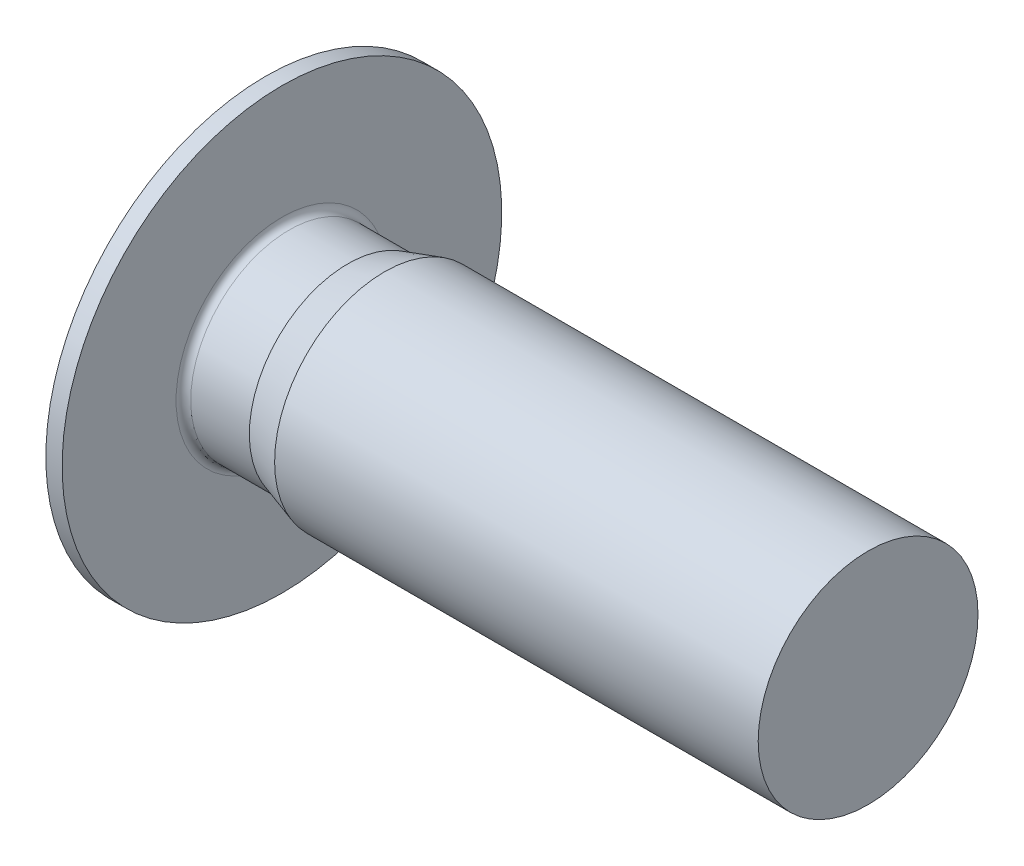
ISO-10303-21;
HEADER;
FILE_DESCRIPTION(('STEP AP214'),'2;1');
FILE_NAME('part.step','',(''),(''),'','','');
FILE_SCHEMA(('AUTOMOTIVE_DESIGN { 1 0 10303 214 1 1 1 1 }'));
ENDSEC;
DATA;
#1=APPLICATION_CONTEXT('core data for automotive mechanical design processes');
#2=APPLICATION_PROTOCOL_DEFINITION('international standard','automotive_design',2000,#1);
#3=PRODUCT_CONTEXT('',#1,'mechanical');
#4=PRODUCT('Part','Part','',(#3));
#5=PRODUCT_RELATED_PRODUCT_CATEGORY('part','',(#4));
#6=PRODUCT_DEFINITION_FORMATION('','',#4);
#7=PRODUCT_DEFINITION_CONTEXT('part definition',#1,'design');
#8=PRODUCT_DEFINITION('design','',#6,#7);
#9=PRODUCT_DEFINITION_SHAPE('','',#8);
#10=(LENGTH_UNIT() NAMED_UNIT(*) SI_UNIT(.MILLI.,.METRE.));
#11=(NAMED_UNIT(*) PLANE_ANGLE_UNIT() SI_UNIT($,.RADIAN.));
#12=(NAMED_UNIT(*) SI_UNIT($,.STERADIAN.) SOLID_ANGLE_UNIT());
#13=UNCERTAINTY_MEASURE_WITH_UNIT(LENGTH_MEASURE(1.E-05),#10,'distance_accuracy_value','');
#14=(GEOMETRIC_REPRESENTATION_CONTEXT(3) GLOBAL_UNCERTAINTY_ASSIGNED_CONTEXT((#13)) GLOBAL_UNIT_ASSIGNED_CONTEXT((#10,
#11,#12)) REPRESENTATION_CONTEXT('',''));
#15=CARTESIAN_POINT('',(0.,0.,0.));
#16=DIRECTION('',(0.,0.,1.));
#17=DIRECTION('',(1.,0.,0.));
#18=AXIS2_PLACEMENT_3D('',#15,#16,#17);
#19=CARTESIAN_POINT('',(1.2,0.,0.));
#20=DIRECTION('',(-1.,0.,0.));
#21=DIRECTION('',(0.,0.,1.));
#22=AXIS2_PLACEMENT_3D('',#19,#20,#21);
#23=PLANE('',#22);
#24=CARTESIAN_POINT('',(1.2,0.,0.));
#25=DIRECTION('',(-1.,0.,0.));
#26=DIRECTION('',(0.,-1.,0.));
#27=AXIS2_PLACEMENT_3D('',#24,#25,#26);
#28=CIRCLE('',#27,0.75);
#29=CARTESIAN_POINT('',(1.2,-0.649519052838329,0.375));
#30=VERTEX_POINT('',#29);
#31=CARTESIAN_POINT('',(1.2,0.,0.75));
#32=VERTEX_POINT('',#31);
#33=EDGE_CURVE('E48',#30,#32,#28,.T.);
#34=ORIENTED_EDGE('',*,*,#33,.F.);
#35=DIRECTION('',(0.,0.5,0.866025403784439));
#36=VECTOR('',#35,1.);
#37=CARTESIAN_POINT('',(1.2,-0.866025403784439,0.));
#38=LINE('',#37,#36);
#39=CARTESIAN_POINT('',(1.2,-0.43301270189222,0.75));
#40=VERTEX_POINT('',#39);
#41=EDGE_CURVE('E263',#30,#40,#38,.T.);
#42=ORIENTED_EDGE('',*,*,#41,.T.);
#43=DIRECTION('',(0.,1.,0.));
#44=VECTOR('',#43,1.);
#45=CARTESIAN_POINT('',(1.2,-0.43301270189222,0.75));
#46=LINE('',#45,#44);
#47=EDGE_CURVE('E231',#40,#32,#46,.T.);
#48=ORIENTED_EDGE('',*,*,#47,.T.);
#49=EDGE_LOOP('',(#34,#42,#48));
#50=FACE_BOUND('',#49,.T.);
#51=ADVANCED_FACE('F37',(#50),#23,.T.);
#52=CARTESIAN_POINT('',(1.2,0.649519052838329,0.375));
#53=VERTEX_POINT('',#52);
#54=EDGE_CURVE('E11',#32,#53,#28,.T.);
#55=ORIENTED_EDGE('',*,*,#54,.F.);
#56=CARTESIAN_POINT('',(1.2,0.43301270189222,0.75));
#57=VERTEX_POINT('',#56);
#58=EDGE_CURVE('E256',#32,#57,#46,.T.);
#59=ORIENTED_EDGE('',*,*,#58,.T.);
#60=DIRECTION('',(0.,0.5,-0.866025403784439));
#61=VECTOR('',#60,1.);
#62=CARTESIAN_POINT('',(1.2,0.43301270189222,0.75));
#63=LINE('',#62,#61);
#64=EDGE_CURVE('E277',#57,#53,#63,.T.);
#65=ORIENTED_EDGE('',*,*,#64,.T.);
#66=EDGE_LOOP('',(#55,#59,#65));
#67=FACE_BOUND('',#66,.T.);
#68=ADVANCED_FACE('F124',(#67),#23,.T.);
#69=CARTESIAN_POINT('',(1.2,0.649519052838329,-0.375));
#70=VERTEX_POINT('',#69);
#71=EDGE_CURVE('E46',#53,#70,#28,.T.);
#72=ORIENTED_EDGE('',*,*,#71,.F.);
#73=CARTESIAN_POINT('',(1.2,0.866025403784439,0.));
#74=VERTEX_POINT('',#73);
#75=EDGE_CURVE('E244',#53,#74,#63,.T.);
#76=ORIENTED_EDGE('',*,*,#75,.T.);
#77=DIRECTION('',(0.,-0.5,-0.866025403784439));
#78=VECTOR('',#77,1.);
#79=CARTESIAN_POINT('',(1.2,0.866025403784439,0.));
#80=LINE('',#79,#78);
#81=EDGE_CURVE('E274',#74,#70,#80,.T.);
#82=ORIENTED_EDGE('',*,*,#81,.T.);
#83=EDGE_LOOP('',(#72,#76,#82));
#84=FACE_BOUND('',#83,.T.);
#85=ADVANCED_FACE('F129',(#84),#23,.T.);
#86=CARTESIAN_POINT('',(1.2,0.,-0.75));
#87=VERTEX_POINT('',#86);
#88=EDGE_CURVE('E222',#70,#87,#28,.T.);
#89=ORIENTED_EDGE('',*,*,#88,.F.);
#90=CARTESIAN_POINT('',(1.2,0.433012701892219,-0.75));
#91=VERTEX_POINT('',#90);
#92=EDGE_CURVE('E276',#70,#91,#80,.T.);
#93=ORIENTED_EDGE('',*,*,#92,.T.);
#94=DIRECTION('',(0.,-1.,0.));
#95=VECTOR('',#94,1.);
#96=CARTESIAN_POINT('',(1.2,0.433012701892219,-0.75));
#97=LINE('',#96,#95);
#98=EDGE_CURVE('E270',#91,#87,#97,.T.);
#99=ORIENTED_EDGE('',*,*,#98,.T.);
#100=EDGE_LOOP('',(#89,#93,#99));
#101=FACE_BOUND('',#100,.T.);
#102=ADVANCED_FACE('F188',(#101),#23,.T.);
#103=CARTESIAN_POINT('',(1.2,-0.649519052838329,-0.375));
#104=VERTEX_POINT('',#103);
#105=EDGE_CURVE('E55',#87,#104,#28,.T.);
#106=ORIENTED_EDGE('',*,*,#105,.F.);
#107=CARTESIAN_POINT('',(1.2,-0.43301270189222,-0.75));
#108=VERTEX_POINT('',#107);
#109=EDGE_CURVE('E273',#87,#108,#97,.T.);
#110=ORIENTED_EDGE('',*,*,#109,.T.);
#111=DIRECTION('',(0.,-0.5,0.866025403784438));
#112=VECTOR('',#111,1.);
#113=CARTESIAN_POINT('',(1.2,-0.43301270189222,-0.75));
#114=LINE('',#113,#112);
#115=EDGE_CURVE('E265',#108,#104,#114,.T.);
#116=ORIENTED_EDGE('',*,*,#115,.T.);
#117=EDGE_LOOP('',(#106,#110,#116));
#118=FACE_BOUND('',#117,.T.);
#119=ADVANCED_FACE('F122',(#118),#23,.T.);
#120=CARTESIAN_POINT('',(-0.8,0.,0.));
#121=DIRECTION('',(-1.,0.,0.));
#122=DIRECTION('',(0.,-1.,0.));
#123=AXIS2_PLACEMENT_3D('',#120,#121,#122);
#124=CYLINDRICAL_SURFACE('',#123,1.345);
#125=CARTESIAN_POINT('',(0.1,0.,0.));
#126=DIRECTION('',(-1.,0.,0.));
#127=DIRECTION('',(0.,-1.,0.));
#128=AXIS2_PLACEMENT_3D('',#125,#126,#127);
#129=CIRCLE('',#128,1.345);
#130=CARTESIAN_POINT('',(0.1,-1.345,0.));
#131=VERTEX_POINT('',#130);
#132=EDGE_CURVE('E41',#131,#131,#129,.F.);
#133=ORIENTED_EDGE('',*,*,#132,.T.);
#134=EDGE_LOOP('',(#133));
#135=FACE_BOUND('',#134,.T.);
#136=CARTESIAN_POINT('',(0.9,0.,0.));
#137=DIRECTION('',(-1.,0.,0.));
#138=DIRECTION('',(0.,-1.,0.));
#139=AXIS2_PLACEMENT_3D('',#136,#137,#138);
#140=CIRCLE('',#139,1.345);
#141=CARTESIAN_POINT('',(0.9,-1.345,0.));
#142=VERTEX_POINT('',#141);
#143=EDGE_CURVE('E195',#142,#142,#140,.T.);
#144=ORIENTED_EDGE('',*,*,#143,.T.);
#145=EDGE_LOOP('',(#144));
#146=FACE_BOUND('',#145,.T.);
#147=ADVANCED_FACE('F181',(#135,#146),#124,.T.);
#148=CARTESIAN_POINT('',(0.,3.,0.));
#149=DIRECTION('',(-1.,0.,0.));
#150=DIRECTION('',(0.,-1.,0.));
#151=AXIS2_PLACEMENT_3D('',#148,#149,#150);
#152=PLANE('',#151);
#153=CARTESIAN_POINT('',(0.,0.,0.));
#154=DIRECTION('',(-1.,0.,0.));
#155=DIRECTION('',(0.,-1.,0.));
#156=AXIS2_PLACEMENT_3D('',#153,#154,#155);
#157=CIRCLE('',#156,1.445);
#158=CARTESIAN_POINT('',(0.,-1.445,0.));
#159=VERTEX_POINT('',#158);
#160=EDGE_CURVE('E218',#159,#159,#157,.T.);
#161=ORIENTED_EDGE('',*,*,#160,.T.);
#162=EDGE_LOOP('',(#161));
#163=FACE_BOUND('',#162,.T.);
#164=CARTESIAN_POINT('',(0.,0.,0.));
#165=DIRECTION('',(-1.,0.,0.));
#166=DIRECTION('',(0.,-1.,0.));
#167=AXIS2_PLACEMENT_3D('',#164,#165,#166);
#168=CIRCLE('',#167,3.);
#169=CARTESIAN_POINT('',(0.,-3.,0.));
#170=VERTEX_POINT('',#169);
#171=EDGE_CURVE('E216',#170,#170,#168,.T.);
#172=ORIENTED_EDGE('',*,*,#171,.F.);
#173=EDGE_LOOP('',(#172));
#174=FACE_BOUND('',#173,.T.);
#175=ADVANCED_FACE('F178',(#163,#174),#152,.F.);
#176=CARTESIAN_POINT('',(-0.8,0.,0.));
#177=DIRECTION('',(-1.,0.,0.));
#178=DIRECTION('',(0.,-1.,0.));
#179=AXIS2_PLACEMENT_3D('',#176,#177,#178);
#180=CYLINDRICAL_SURFACE('',#179,3.);
#181=CARTESIAN_POINT('',(-0.222649730810382,0.,0.));
#182=DIRECTION('',(-1.,0.,0.));
#183=DIRECTION('',(0.,-1.,0.));
#184=AXIS2_PLACEMENT_3D('',#181,#182,#183);
#185=CIRCLE('',#184,3.);
#186=CARTESIAN_POINT('',(-0.222649730810382,-3.,0.));
#187=VERTEX_POINT('',#186);
#188=EDGE_CURVE('E213',#187,#187,#185,.T.);
#189=ORIENTED_EDGE('',*,*,#188,.F.);
#190=EDGE_LOOP('',(#189));
#191=FACE_BOUND('',#190,.T.);
#192=ORIENTED_EDGE('',*,*,#171,.T.);
#193=EDGE_LOOP('',(#192));
#194=FACE_BOUND('',#193,.T.);
#195=ADVANCED_FACE('F174',(#191,#194),#180,.T.);
#196=CARTESIAN_POINT('',(-0.222649730810382,0.,0.));
#197=DIRECTION('',(1.,0.,0.));
#198=DIRECTION('',(0.,1.,0.));
#199=AXIS2_PLACEMENT_3D('',#196,#197,#198);
#200=CONICAL_SURFACE('',#199,3.,1.0471975511966);
#201=CARTESIAN_POINT('',(-0.8,0.,0.));
#202=DIRECTION('',(-1.,0.,0.));
#203=DIRECTION('',(0.,-1.,0.));
#204=AXIS2_PLACEMENT_3D('',#201,#202,#203);
#205=CIRCLE('',#204,2.);
#206=CARTESIAN_POINT('',(-0.799999999999999,-2.,0.));
#207=VERTEX_POINT('',#206);
#208=EDGE_CURVE('E210',#207,#207,#205,.T.);
#209=ORIENTED_EDGE('',*,*,#208,.F.);
#210=EDGE_LOOP('',(#209));
#211=FACE_BOUND('',#210,.T.);
#212=ORIENTED_EDGE('',*,*,#188,.T.);
#213=EDGE_LOOP('',(#212));
#214=FACE_BOUND('',#213,.T.);
#215=ADVANCED_FACE('F170',(#211,#214),#200,.T.);
#216=CARTESIAN_POINT('',(-0.8,0.,0.));
#217=DIRECTION('',(1.,0.,0.));
#218=DIRECTION('',(0.,1.,0.));
#219=AXIS2_PLACEMENT_3D('',#216,#217,#218);
#220=PLANE('',#219);
#221=DIRECTION('',(0.,-0.5,-0.866025403784439));
#222=VECTOR('',#221,1.);
#223=CARTESIAN_POINT('',(-0.8,0.866025403784439,0.));
#224=LINE('',#223,#222);
#225=CARTESIAN_POINT('',(-0.8,0.866025403784439,0.));
#226=VERTEX_POINT('',#225);
#227=CARTESIAN_POINT('',(-0.8,0.433012701892219,-0.75));
#228=VERTEX_POINT('',#227);
#229=EDGE_CURVE('E225',#226,#228,#224,.T.);
#230=ORIENTED_EDGE('',*,*,#229,.F.);
#231=DIRECTION('',(0.,0.5,-0.866025403784439));
#232=VECTOR('',#231,1.);
#233=CARTESIAN_POINT('',(-0.8,0.43301270189222,0.75));
#234=LINE('',#233,#232);
#235=CARTESIAN_POINT('',(-0.8,0.43301270189222,0.75));
#236=VERTEX_POINT('',#235);
#237=EDGE_CURVE('E63',#236,#226,#234,.T.);
#238=ORIENTED_EDGE('',*,*,#237,.F.);
#239=DIRECTION('',(0.,1.,0.));
#240=VECTOR('',#239,1.);
#241=CARTESIAN_POINT('',(-0.8,-0.43301270189222,0.75));
#242=LINE('',#241,#240);
#243=CARTESIAN_POINT('',(-0.8,-0.43301270189222,0.75));
#244=VERTEX_POINT('',#243);
#245=EDGE_CURVE('E242',#244,#236,#242,.T.);
#246=ORIENTED_EDGE('',*,*,#245,.F.);
#247=DIRECTION('',(0.,0.5,0.866025403784439));
#248=VECTOR('',#247,1.);
#249=CARTESIAN_POINT('',(-0.8,-0.866025403784439,0.));
#250=LINE('',#249,#248);
#251=CARTESIAN_POINT('',(-0.8,-0.866025403784439,0.));
#252=VERTEX_POINT('',#251);
#253=EDGE_CURVE('E239',#252,#244,#250,.T.);
#254=ORIENTED_EDGE('',*,*,#253,.F.);
#255=DIRECTION('',(0.,-0.5,0.866025403784438));
#256=VECTOR('',#255,1.);
#257=CARTESIAN_POINT('',(-0.8,-0.43301270189222,-0.75));
#258=LINE('',#257,#256);
#259=CARTESIAN_POINT('',(-0.8,-0.43301270189222,-0.75));
#260=VERTEX_POINT('',#259);
#261=EDGE_CURVE('E236',#260,#252,#258,.T.);
#262=ORIENTED_EDGE('',*,*,#261,.F.);
#263=DIRECTION('',(0.,-1.,0.));
#264=VECTOR('',#263,1.);
#265=CARTESIAN_POINT('',(-0.8,0.433012701892219,-0.75));
#266=LINE('',#265,#264);
#267=EDGE_CURVE('E228',#228,#260,#266,.T.);
#268=ORIENTED_EDGE('',*,*,#267,.F.);
#269=EDGE_LOOP('',(#230,#238,#246,#254,#262,#268));
#270=FACE_BOUND('',#269,.T.);
#271=ORIENTED_EDGE('',*,*,#208,.T.);
#272=EDGE_LOOP('',(#271));
#273=FACE_BOUND('',#272,.T.);
#274=ADVANCED_FACE('F166',(#270,#273),#220,.F.);
#275=CARTESIAN_POINT('',(8.,1.5,0.));
#276=DIRECTION('',(-1.,0.,0.));
#277=DIRECTION('',(0.,-1.,0.));
#278=AXIS2_PLACEMENT_3D('',#275,#276,#277);
#279=PLANE('',#278);
#280=CARTESIAN_POINT('',(8.,0.,0.));
#281=DIRECTION('',(-1.,0.,0.));
#282=DIRECTION('',(0.,-1.,0.));
#283=AXIS2_PLACEMENT_3D('',#280,#281,#282);
#284=CIRCLE('',#283,1.5);
#285=CARTESIAN_POINT('',(8.,-1.5,0.));
#286=VERTEX_POINT('',#285);
#287=EDGE_CURVE('E200',#286,#286,#284,.T.);
#288=ORIENTED_EDGE('',*,*,#287,.F.);
#289=EDGE_LOOP('',(#288));
#290=FACE_BOUND('',#289,.T.);
#291=ADVANCED_FACE('F162',(#290),#279,.F.);
#292=CARTESIAN_POINT('',(-0.8,0.,0.));
#293=DIRECTION('',(-1.,0.,0.));
#294=DIRECTION('',(0.,-1.,0.));
#295=AXIS2_PLACEMENT_3D('',#292,#293,#294);
#296=CYLINDRICAL_SURFACE('',#295,1.5);
#297=CARTESIAN_POINT('',(1.4,0.,0.));
#298=DIRECTION('',(-1.,0.,0.));
#299=DIRECTION('',(0.,-1.,0.));
#300=AXIS2_PLACEMENT_3D('',#297,#298,#299);
#301=CIRCLE('',#300,1.5);
#302=CARTESIAN_POINT('',(1.4,-1.5,0.));
#303=VERTEX_POINT('',#302);
#304=EDGE_CURVE('E196',#303,#303,#301,.T.);
#305=ORIENTED_EDGE('',*,*,#304,.F.);
#306=EDGE_LOOP('',(#305));
#307=FACE_BOUND('',#306,.T.);
#308=ORIENTED_EDGE('',*,*,#287,.T.);
#309=EDGE_LOOP('',(#308));
#310=FACE_BOUND('',#309,.T.);
#311=ADVANCED_FACE('F158',(#307,#310),#296,.T.);
#312=CARTESIAN_POINT('',(1.4,0.,0.));
#313=DIRECTION('',(1.,0.,0.));
#314=DIRECTION('',(0.,1.,0.));
#315=AXIS2_PLACEMENT_3D('',#312,#313,#314);
#316=CONICAL_SURFACE('',#315,1.5,0.300605670042395);
#317=ORIENTED_EDGE('',*,*,#143,.F.);
#318=EDGE_LOOP('',(#317));
#319=FACE_BOUND('',#318,.T.);
#320=ORIENTED_EDGE('',*,*,#304,.T.);
#321=EDGE_LOOP('',(#320));
#322=FACE_BOUND('',#321,.T.);
#323=ADVANCED_FACE('F155',(#319,#322),#316,.T.);
#324=CARTESIAN_POINT('',(0.1,0.,0.));
#325=DIRECTION('',(-1.,0.,0.));
#326=DIRECTION('',(0.,-1.,0.));
#327=AXIS2_PLACEMENT_3D('',#324,#325,#326);
#328=TOROIDAL_SURFACE('',#327,1.445,0.1);
#329=ORIENTED_EDGE('',*,*,#132,.F.);
#330=EDGE_LOOP('',(#329));
#331=FACE_BOUND('',#330,.T.);
#332=ORIENTED_EDGE('',*,*,#160,.F.);
#333=EDGE_LOOP('',(#332));
#334=FACE_BOUND('',#333,.T.);
#335=ADVANCED_FACE('F39',(#331,#334),#328,.F.);
#336=CARTESIAN_POINT('',(1.2,0.43301270189222,0.75));
#337=DIRECTION('',(0.,0.866025403784439,0.5));
#338=DIRECTION('',(0.,-0.5,0.866025403784439));
#339=AXIS2_PLACEMENT_3D('',#336,#337,#338);
#340=PLANE('',#339);
#341=ORIENTED_EDGE('',*,*,#237,.T.);
#342=DIRECTION('',(-1.,0.,0.));
#343=VECTOR('',#342,1.);
#344=CARTESIAN_POINT('',(1.2,0.866025403784439,0.));
#345=LINE('',#344,#343);
#346=EDGE_CURVE('E205',#74,#226,#345,.T.);
#347=ORIENTED_EDGE('',*,*,#346,.F.);
#348=ORIENTED_EDGE('',*,*,#75,.F.);
#349=ORIENTED_EDGE('',*,*,#64,.F.);
#350=DIRECTION('',(-1.,0.,0.));
#351=VECTOR('',#350,1.);
#352=CARTESIAN_POINT('',(1.2,0.43301270189222,0.75));
#353=LINE('',#352,#351);
#354=EDGE_CURVE('E197',#57,#236,#353,.T.);
#355=ORIENTED_EDGE('',*,*,#354,.T.);
#356=EDGE_LOOP('',(#341,#347,#348,#349,#355));
#357=FACE_BOUND('',#356,.T.);
#358=ADVANCED_FACE('F137',(#357),#340,.F.);
#359=CARTESIAN_POINT('',(1.2,-0.43301270189222,0.75));
#360=DIRECTION('',(0.,0.,1.));
#361=DIRECTION('',(0.,-1.,0.));
#362=AXIS2_PLACEMENT_3D('',#359,#360,#361);
#363=PLANE('',#362);
#364=ORIENTED_EDGE('',*,*,#245,.T.);
#365=ORIENTED_EDGE('',*,*,#354,.F.);
#366=ORIENTED_EDGE('',*,*,#58,.F.);
#367=ORIENTED_EDGE('',*,*,#47,.F.);
#368=DIRECTION('',(-1.,0.,0.));
#369=VECTOR('',#368,1.);
#370=CARTESIAN_POINT('',(1.2,-0.43301270189222,0.75));
#371=LINE('',#370,#369);
#372=EDGE_CURVE('E202',#40,#244,#371,.T.);
#373=ORIENTED_EDGE('',*,*,#372,.T.);
#374=EDGE_LOOP('',(#364,#365,#366,#367,#373));
#375=FACE_BOUND('',#374,.T.);
#376=ADVANCED_FACE('F133',(#375),#363,.F.);
#377=CARTESIAN_POINT('',(1.2,-0.866025403784439,0.));
#378=DIRECTION('',(0.,-0.866025403784439,0.5));
#379=DIRECTION('',(0.,-0.5,-0.866025403784439));
#380=AXIS2_PLACEMENT_3D('',#377,#378,#379);
#381=PLANE('',#380);
#382=ORIENTED_EDGE('',*,*,#253,.T.);
#383=ORIENTED_EDGE('',*,*,#372,.F.);
#384=ORIENTED_EDGE('',*,*,#41,.F.);
#385=CARTESIAN_POINT('',(1.2,-0.866025403784439,0.));
#386=VERTEX_POINT('',#385);
#387=EDGE_CURVE('E258',#386,#30,#38,.T.);
#388=ORIENTED_EDGE('',*,*,#387,.F.);
#389=DIRECTION('',(-1.,0.,0.));
#390=VECTOR('',#389,1.);
#391=CARTESIAN_POINT('',(1.2,-0.866025403784439,0.));
#392=LINE('',#391,#390);
#393=EDGE_CURVE('E247',#386,#252,#392,.T.);
#394=ORIENTED_EDGE('',*,*,#393,.T.);
#395=EDGE_LOOP('',(#382,#383,#384,#388,#394));
#396=FACE_BOUND('',#395,.T.);
#397=ADVANCED_FACE('F136',(#396),#381,.F.);
#398=CARTESIAN_POINT('',(1.2,-0.43301270189222,-0.75));
#399=DIRECTION('',(0.,-0.866025403784439,-0.5));
#400=DIRECTION('',(0.,0.5,-0.866025403784439));
#401=AXIS2_PLACEMENT_3D('',#398,#399,#400);
#402=PLANE('',#401);
#403=ORIENTED_EDGE('',*,*,#261,.T.);
#404=ORIENTED_EDGE('',*,*,#393,.F.);
#405=EDGE_CURVE('E269',#104,#386,#114,.T.);
#406=ORIENTED_EDGE('',*,*,#405,.F.);
#407=ORIENTED_EDGE('',*,*,#115,.F.);
#408=DIRECTION('',(-1.,0.,0.));
#409=VECTOR('',#408,1.);
#410=CARTESIAN_POINT('',(1.2,-0.43301270189222,-0.75));
#411=LINE('',#410,#409);
#412=EDGE_CURVE('E249',#108,#260,#411,.T.);
#413=ORIENTED_EDGE('',*,*,#412,.T.);
#414=EDGE_LOOP('',(#403,#404,#406,#407,#413));
#415=FACE_BOUND('',#414,.T.);
#416=ADVANCED_FACE('F141',(#415),#402,.F.);
#417=CARTESIAN_POINT('',(1.2,0.433012701892219,-0.75));
#418=DIRECTION('',(0.,0.,-1.));
#419=DIRECTION('',(-1.,0.,0.));
#420=AXIS2_PLACEMENT_3D('',#417,#418,#419);
#421=PLANE('',#420);
#422=ORIENTED_EDGE('',*,*,#267,.T.);
#423=ORIENTED_EDGE('',*,*,#412,.F.);
#424=ORIENTED_EDGE('',*,*,#109,.F.);
#425=ORIENTED_EDGE('',*,*,#98,.F.);
#426=DIRECTION('',(-1.,0.,0.));
#427=VECTOR('',#426,1.);
#428=CARTESIAN_POINT('',(1.2,0.433012701892219,-0.75));
#429=LINE('',#428,#427);
#430=EDGE_CURVE('E250',#91,#228,#429,.T.);
#431=ORIENTED_EDGE('',*,*,#430,.T.);
#432=EDGE_LOOP('',(#422,#423,#424,#425,#431));
#433=FACE_BOUND('',#432,.T.);
#434=ADVANCED_FACE('F145',(#433),#421,.F.);
#435=CARTESIAN_POINT('',(1.2,0.866025403784439,0.));
#436=DIRECTION('',(0.,0.866025403784439,-0.5));
#437=DIRECTION('',(0.,0.5,0.866025403784439));
#438=AXIS2_PLACEMENT_3D('',#435,#436,#437);
#439=PLANE('',#438);
#440=ORIENTED_EDGE('',*,*,#229,.T.);
#441=ORIENTED_EDGE('',*,*,#430,.F.);
#442=ORIENTED_EDGE('',*,*,#92,.F.);
#443=ORIENTED_EDGE('',*,*,#81,.F.);
#444=ORIENTED_EDGE('',*,*,#346,.T.);
#445=EDGE_LOOP('',(#440,#441,#442,#443,#444));
#446=FACE_BOUND('',#445,.T.);
#447=ADVANCED_FACE('F119',(#446),#439,.F.);
#448=EDGE_CURVE('E221',#104,#30,#28,.T.);
#449=ORIENTED_EDGE('',*,*,#448,.F.);
#450=ORIENTED_EDGE('',*,*,#405,.T.);
#451=ORIENTED_EDGE('',*,*,#387,.T.);
#452=EDGE_LOOP('',(#449,#450,#451));
#453=FACE_BOUND('',#452,.T.);
#454=ADVANCED_FACE('F114',(#453),#23,.T.);
#455=CARTESIAN_POINT('',(1.65064546427067,0.,0.));
#456=DIRECTION('',(-1.,0.,0.));
#457=DIRECTION('',(0.,-1.,0.));
#458=AXIS2_PLACEMENT_3D('',#455,#456,#457);
#459=CONICAL_SURFACE('',#458,0.,1.02974425867666);
#460=ORIENTED_EDGE('',*,*,#33,.T.);
#461=ORIENTED_EDGE('',*,*,#54,.T.);
#462=ORIENTED_EDGE('',*,*,#71,.T.);
#463=ORIENTED_EDGE('',*,*,#88,.T.);
#464=ORIENTED_EDGE('',*,*,#105,.T.);
#465=ORIENTED_EDGE('',*,*,#448,.T.);
#466=EDGE_LOOP('',(#460,#461,#462,#463,#464,#465));
#467=FACE_BOUND('',#466,.T.);
#468=CARTESIAN_POINT('',(1.65064546427067,0.,0.));
#469=VERTEX_POINT('',#468);
#470=VERTEX_LOOP('',#469);
#471=FACE_BOUND('',#470,.T.);
#472=ADVANCED_FACE('F112',(#467,#471),#459,.F.);
#473=CLOSED_SHELL('',(#51,#68,#85,#102,#119,#147,#175,#195,#215,#274,#291,#311,#323,#335,#358,
#376,#397,#416,#434,#447,#454,#472));
#474=MANIFOLD_SOLID_BREP('B2',#473);
#475=ADVANCED_BREP_SHAPE_REPRESENTATION('',(#18,#474),#14);
#476=SHAPE_DEFINITION_REPRESENTATION(#9,#475);
ENDSEC;
END-ISO-10303-21;
